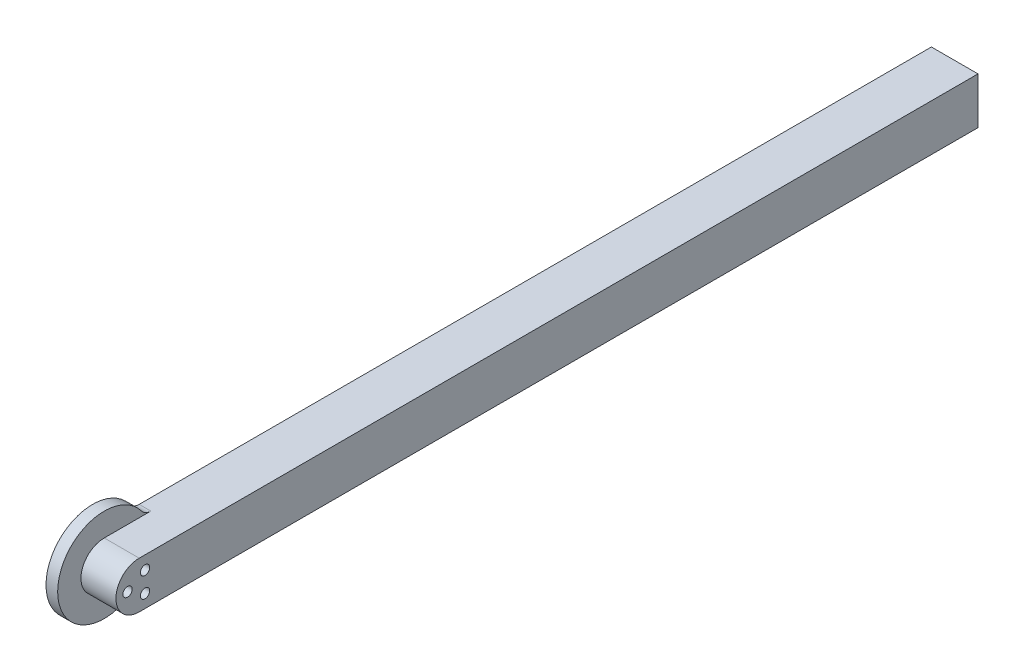
ISO-10303-21;
HEADER;
FILE_DESCRIPTION(('STEP AP214'),'2;1');
FILE_NAME('part.step','',(''),(''),'','','');
FILE_SCHEMA(('AUTOMOTIVE_DESIGN { 1 0 10303 214 1 1 1 1 }'));
ENDSEC;
DATA;
#1=APPLICATION_CONTEXT('core data for automotive mechanical design processes');
#2=APPLICATION_PROTOCOL_DEFINITION('international standard','automotive_design',2000,#1);
#3=PRODUCT_CONTEXT('',#1,'mechanical');
#4=PRODUCT('Part','Part','',(#3));
#5=PRODUCT_RELATED_PRODUCT_CATEGORY('part','',(#4));
#6=PRODUCT_DEFINITION_FORMATION('','',#4);
#7=PRODUCT_DEFINITION_CONTEXT('part definition',#1,'design');
#8=PRODUCT_DEFINITION('design','',#6,#7);
#9=PRODUCT_DEFINITION_SHAPE('','',#8);
#10=(LENGTH_UNIT() NAMED_UNIT(*) SI_UNIT(.MILLI.,.METRE.));
#11=(NAMED_UNIT(*) PLANE_ANGLE_UNIT() SI_UNIT($,.RADIAN.));
#12=(NAMED_UNIT(*) SI_UNIT($,.STERADIAN.) SOLID_ANGLE_UNIT());
#13=UNCERTAINTY_MEASURE_WITH_UNIT(LENGTH_MEASURE(1.E-05),#10,'distance_accuracy_value','');
#14=(GEOMETRIC_REPRESENTATION_CONTEXT(3) GLOBAL_UNCERTAINTY_ASSIGNED_CONTEXT((#13)) GLOBAL_UNIT_ASSIGNED_CONTEXT((#10,
#11,#12)) REPRESENTATION_CONTEXT('',''));
#15=CARTESIAN_POINT('',(0.,0.,0.));
#16=DIRECTION('',(0.,0.,1.));
#17=DIRECTION('',(1.,0.,0.));
#18=AXIS2_PLACEMENT_3D('',#15,#16,#17);
#19=CARTESIAN_POINT('',(12.7,0.,0.));
#20=DIRECTION('',(-1.,0.,0.));
#21=DIRECTION('',(0.,0.,1.));
#22=AXIS2_PLACEMENT_3D('',#19,#20,#21);
#23=CYLINDRICAL_SURFACE('',#22,12.7);
#24=CARTESIAN_POINT('',(-6.35,0.,0.));
#25=DIRECTION('',(-1.,0.,0.));
#26=DIRECTION('',(0.,0.,1.));
#27=AXIS2_PLACEMENT_3D('',#24,#25,#26);
#28=CIRCLE('',#27,12.7);
#29=CARTESIAN_POINT('',(-6.35,-12.7,0.));
#30=VERTEX_POINT('',#29);
#31=CARTESIAN_POINT('',(-6.35,12.7,0.));
#32=VERTEX_POINT('',#31);
#33=EDGE_CURVE('E121',#30,#32,#28,.T.);
#34=ORIENTED_EDGE('',*,*,#33,.F.);
#35=DIRECTION('',(-1.,0.,0.));
#36=VECTOR('',#35,1.);
#37=CARTESIAN_POINT('',(12.7,-12.7,0.));
#38=LINE('',#37,#36);
#39=CARTESIAN_POINT('',(12.7,-12.7,0.));
#40=VERTEX_POINT('',#39);
#41=EDGE_CURVE('E102',#40,#30,#38,.T.);
#42=ORIENTED_EDGE('',*,*,#41,.F.);
#43=CARTESIAN_POINT('',(12.7,0.,0.));
#44=DIRECTION('',(1.,0.,0.));
#45=DIRECTION('',(0.,0.,1.));
#46=AXIS2_PLACEMENT_3D('',#43,#44,#45);
#47=CIRCLE('',#46,12.7);
#48=CARTESIAN_POINT('',(12.7,12.7,0.));
#49=VERTEX_POINT('',#48);
#50=EDGE_CURVE('E109',#49,#40,#47,.T.);
#51=ORIENTED_EDGE('',*,*,#50,.F.);
#52=DIRECTION('',(-1.,0.,0.));
#53=VECTOR('',#52,1.);
#54=CARTESIAN_POINT('',(12.7,12.7,0.));
#55=LINE('',#54,#53);
#56=EDGE_CURVE('E166',#49,#32,#55,.T.);
#57=ORIENTED_EDGE('',*,*,#56,.T.);
#58=EDGE_LOOP('',(#34,#42,#51,#57));
#59=FACE_BOUND('',#58,.T.);
#60=ADVANCED_FACE('F33',(#59),#23,.T.);
#61=CARTESIAN_POINT('',(12.7,5.49926131403119,-3.17499999999999));
#62=DIRECTION('',(-1.,0.,0.));
#63=DIRECTION('',(0.,0.,1.));
#64=AXIS2_PLACEMENT_3D('',#61,#62,#63);
#65=CYLINDRICAL_SURFACE('',#64,2.5527);
#66=CARTESIAN_POINT('',(12.7,5.49926131403119,-3.17499999999999));
#67=DIRECTION('',(1.,0.,0.));
#68=DIRECTION('',(0.,0.,-1.));
#69=AXIS2_PLACEMENT_3D('',#66,#67,#68);
#70=CIRCLE('',#69,2.5527);
#71=CARTESIAN_POINT('',(12.7,5.49926131403119,-5.72769999999999));
#72=VERTEX_POINT('',#71);
#73=EDGE_CURVE('E169',#72,#72,#70,.T.);
#74=ORIENTED_EDGE('',*,*,#73,.T.);
#75=EDGE_LOOP('',(#74));
#76=FACE_BOUND('',#75,.T.);
#77=CARTESIAN_POINT('',(-12.7,5.49926131403119,-3.17499999999999));
#78=DIRECTION('',(1.,0.,0.));
#79=DIRECTION('',(0.,0.,-1.));
#80=AXIS2_PLACEMENT_3D('',#77,#78,#79);
#81=CIRCLE('',#80,2.5527);
#82=CARTESIAN_POINT('',(-12.7,5.49926131403119,-5.72769999999999));
#83=VERTEX_POINT('',#82);
#84=EDGE_CURVE('E186',#83,#83,#81,.T.);
#85=ORIENTED_EDGE('',*,*,#84,.F.);
#86=EDGE_LOOP('',(#85));
#87=FACE_BOUND('',#86,.T.);
#88=ADVANCED_FACE('F203',(#76,#87),#65,.F.);
#89=CARTESIAN_POINT('',(12.7,0.,6.35));
#90=DIRECTION('',(-1.,0.,0.));
#91=DIRECTION('',(0.,0.,1.));
#92=AXIS2_PLACEMENT_3D('',#89,#90,#91);
#93=CYLINDRICAL_SURFACE('',#92,2.5527);
#94=CARTESIAN_POINT('',(12.7,0.,6.35));
#95=DIRECTION('',(1.,0.,0.));
#96=DIRECTION('',(0.,0.,-1.));
#97=AXIS2_PLACEMENT_3D('',#94,#95,#96);
#98=CIRCLE('',#97,2.5527);
#99=CARTESIAN_POINT('',(12.7,0.,3.7973));
#100=VERTEX_POINT('',#99);
#101=EDGE_CURVE('E172',#100,#100,#98,.T.);
#102=ORIENTED_EDGE('',*,*,#101,.T.);
#103=EDGE_LOOP('',(#102));
#104=FACE_BOUND('',#103,.T.);
#105=CARTESIAN_POINT('',(-12.7,0.,6.35));
#106=DIRECTION('',(1.,0.,0.));
#107=DIRECTION('',(0.,0.,-1.));
#108=AXIS2_PLACEMENT_3D('',#105,#106,#107);
#109=CIRCLE('',#108,2.5527);
#110=CARTESIAN_POINT('',(-12.7,0.,3.7973));
#111=VERTEX_POINT('',#110);
#112=EDGE_CURVE('E193',#111,#111,#109,.T.);
#113=ORIENTED_EDGE('',*,*,#112,.F.);
#114=EDGE_LOOP('',(#113));
#115=FACE_BOUND('',#114,.T.);
#116=ADVANCED_FACE('F200',(#104,#115),#93,.F.);
#117=CARTESIAN_POINT('',(12.7,-5.49926131403119,-3.17499999999999));
#118=DIRECTION('',(-1.,0.,0.));
#119=DIRECTION('',(0.,0.,1.));
#120=AXIS2_PLACEMENT_3D('',#117,#118,#119);
#121=CYLINDRICAL_SURFACE('',#120,2.5527);
#122=CARTESIAN_POINT('',(12.7,-5.49926131403119,-3.17499999999999));
#123=DIRECTION('',(1.,0.,0.));
#124=DIRECTION('',(0.,0.,-1.));
#125=AXIS2_PLACEMENT_3D('',#122,#123,#124);
#126=CIRCLE('',#125,2.5527);
#127=CARTESIAN_POINT('',(12.7,-5.49926131403119,-5.72769999999999));
#128=VERTEX_POINT('',#127);
#129=EDGE_CURVE('E177',#128,#128,#126,.T.);
#130=ORIENTED_EDGE('',*,*,#129,.T.);
#131=EDGE_LOOP('',(#130));
#132=FACE_BOUND('',#131,.T.);
#133=CARTESIAN_POINT('',(-12.7,-5.49926131403119,-3.17499999999999));
#134=DIRECTION('',(1.,0.,0.));
#135=DIRECTION('',(0.,0.,-1.));
#136=AXIS2_PLACEMENT_3D('',#133,#134,#135);
#137=CIRCLE('',#136,2.5527);
#138=CARTESIAN_POINT('',(-12.7,-5.49926131403119,-5.72769999999999));
#139=VERTEX_POINT('',#138);
#140=EDGE_CURVE('E190',#139,#139,#137,.T.);
#141=ORIENTED_EDGE('',*,*,#140,.F.);
#142=EDGE_LOOP('',(#141));
#143=FACE_BOUND('',#142,.T.);
#144=ADVANCED_FACE('F202',(#132,#143),#121,.F.);
#145=CARTESIAN_POINT('',(12.7,0.,0.));
#146=DIRECTION('',(-1.,0.,0.));
#147=DIRECTION('',(0.,0.,1.));
#148=AXIS2_PLACEMENT_3D('',#145,#146,#147);
#149=PLANE('',#148);
#150=ORIENTED_EDGE('',*,*,#101,.F.);
#151=EDGE_LOOP('',(#150));
#152=FACE_BOUND('',#151,.T.);
#153=ORIENTED_EDGE('',*,*,#50,.T.);
#154=DIRECTION('',(0.,0.,-1.));
#155=VECTOR('',#154,1.);
#156=CARTESIAN_POINT('',(12.7,-12.7,0.));
#157=LINE('',#156,#155);
#158=CARTESIAN_POINT('',(12.7,-12.7,-457.2));
#159=VERTEX_POINT('',#158);
#160=EDGE_CURVE('E98',#40,#159,#157,.T.);
#161=ORIENTED_EDGE('',*,*,#160,.T.);
#162=DIRECTION('',(0.,1.,0.));
#163=VECTOR('',#162,1.);
#164=CARTESIAN_POINT('',(12.7,12.7,-457.2));
#165=LINE('',#164,#163);
#166=CARTESIAN_POINT('',(12.7,12.7,-457.2));
#167=VERTEX_POINT('',#166);
#168=EDGE_CURVE('E108',#159,#167,#165,.T.);
#169=ORIENTED_EDGE('',*,*,#168,.T.);
#170=DIRECTION('',(0.,0.,1.));
#171=VECTOR('',#170,1.);
#172=CARTESIAN_POINT('',(12.7,12.7,0.));
#173=LINE('',#172,#171);
#174=EDGE_CURVE('E115',#167,#49,#173,.T.);
#175=ORIENTED_EDGE('',*,*,#174,.T.);
#176=EDGE_LOOP('',(#153,#161,#169,#175));
#177=FACE_BOUND('',#176,.T.);
#178=ORIENTED_EDGE('',*,*,#73,.F.);
#179=EDGE_LOOP('',(#178));
#180=FACE_BOUND('',#179,.T.);
#181=ORIENTED_EDGE('',*,*,#129,.F.);
#182=EDGE_LOOP('',(#181));
#183=FACE_BOUND('',#182,.T.);
#184=ADVANCED_FACE('F112',(#152,#177,#180,#183),#149,.F.);
#185=CARTESIAN_POINT('',(-12.7,0.,0.));
#186=DIRECTION('',(-1.,0.,0.));
#187=DIRECTION('',(0.,0.,1.));
#188=AXIS2_PLACEMENT_3D('',#185,#186,#187);
#189=PLANE('',#188);
#190=ORIENTED_EDGE('',*,*,#112,.T.);
#191=EDGE_LOOP('',(#190));
#192=FACE_BOUND('',#191,.T.);
#193=ORIENTED_EDGE('',*,*,#140,.T.);
#194=EDGE_LOOP('',(#193));
#195=FACE_BOUND('',#194,.T.);
#196=ORIENTED_EDGE('',*,*,#84,.T.);
#197=EDGE_LOOP('',(#196));
#198=FACE_BOUND('',#197,.T.);
#199=DIRECTION('',(0.,0.,-1.));
#200=VECTOR('',#199,1.);
#201=CARTESIAN_POINT('',(-12.7,-12.7,0.));
#202=LINE('',#201,#200);
#203=CARTESIAN_POINT('',(-12.7,-12.7,-25.4));
#204=VERTEX_POINT('',#203);
#205=CARTESIAN_POINT('',(-12.7,-12.7,-457.2));
#206=VERTEX_POINT('',#205);
#207=EDGE_CURVE('E162',#204,#206,#202,.T.);
#208=ORIENTED_EDGE('',*,*,#207,.F.);
#209=CARTESIAN_POINT('',(-12.7,-19.05,-25.4));
#210=DIRECTION('',(-1.,0.,0.));
#211=DIRECTION('',(0.,0.,1.));
#212=AXIS2_PLACEMENT_3D('',#209,#210,#211);
#213=CIRCLE('',#212,6.35);
#214=CARTESIAN_POINT('',(-12.7,-15.24,-20.32));
#215=VERTEX_POINT('',#214);
#216=EDGE_CURVE('E137',#204,#215,#213,.F.);
#217=ORIENTED_EDGE('',*,*,#216,.T.);
#218=CARTESIAN_POINT('',(-12.7,0.,0.));
#219=DIRECTION('',(-1.,0.,0.));
#220=DIRECTION('',(0.,0.,1.));
#221=AXIS2_PLACEMENT_3D('',#218,#219,#220);
#222=CIRCLE('',#221,25.4);
#223=CARTESIAN_POINT('',(-12.7,15.24,-20.32));
#224=VERTEX_POINT('',#223);
#225=EDGE_CURVE('E153',#215,#224,#222,.T.);
#226=ORIENTED_EDGE('',*,*,#225,.T.);
#227=CARTESIAN_POINT('',(-12.7,19.05,-25.4));
#228=DIRECTION('',(-1.,0.,0.));
#229=DIRECTION('',(0.,0.,1.));
#230=AXIS2_PLACEMENT_3D('',#227,#228,#229);
#231=CIRCLE('',#230,6.35);
#232=CARTESIAN_POINT('',(-12.7,12.7,-25.4));
#233=VERTEX_POINT('',#232);
#234=EDGE_CURVE('E11',#224,#233,#231,.F.);
#235=ORIENTED_EDGE('',*,*,#234,.T.);
#236=DIRECTION('',(0.,0.,1.));
#237=VECTOR('',#236,1.);
#238=CARTESIAN_POINT('',(-12.7,12.7,0.));
#239=LINE('',#238,#237);
#240=CARTESIAN_POINT('',(-12.7,12.7,-457.2));
#241=VERTEX_POINT('',#240);
#242=EDGE_CURVE('E119',#241,#233,#239,.T.);
#243=ORIENTED_EDGE('',*,*,#242,.F.);
#244=DIRECTION('',(0.,1.,0.));
#245=VECTOR('',#244,1.);
#246=CARTESIAN_POINT('',(-12.7,12.7,-457.2));
#247=LINE('',#246,#245);
#248=EDGE_CURVE('E160',#206,#241,#247,.T.);
#249=ORIENTED_EDGE('',*,*,#248,.F.);
#250=EDGE_LOOP('',(#208,#217,#226,#235,#243,#249));
#251=FACE_BOUND('',#250,.T.);
#252=ADVANCED_FACE('F197',(#192,#195,#198,#251),#189,.T.);
#253=CARTESIAN_POINT('',(12.7,-12.7,0.));
#254=DIRECTION('',(0.,1.,0.));
#255=DIRECTION('',(0.,0.,1.));
#256=AXIS2_PLACEMENT_3D('',#253,#254,#255);
#257=PLANE('',#256);
#258=DIRECTION('',(0.,0.,1.));
#259=VECTOR('',#258,1.);
#260=CARTESIAN_POINT('',(-6.35,-12.7,0.));
#261=LINE('',#260,#259);
#262=CARTESIAN_POINT('',(-6.35,-12.7,-25.4));
#263=VERTEX_POINT('',#262);
#264=EDGE_CURVE('E182',#263,#30,#261,.T.);
#265=ORIENTED_EDGE('',*,*,#264,.F.);
#266=DIRECTION('',(-1.,0.,0.));
#267=VECTOR('',#266,1.);
#268=CARTESIAN_POINT('',(12.7,-12.7,-25.4));
#269=LINE('',#268,#267);
#270=EDGE_CURVE('E122',#263,#204,#269,.T.);
#271=ORIENTED_EDGE('',*,*,#270,.T.);
#272=ORIENTED_EDGE('',*,*,#207,.T.);
#273=DIRECTION('',(-1.,0.,0.));
#274=VECTOR('',#273,1.);
#275=CARTESIAN_POINT('',(12.7,-12.7,-457.2));
#276=LINE('',#275,#274);
#277=EDGE_CURVE('E105',#159,#206,#276,.T.);
#278=ORIENTED_EDGE('',*,*,#277,.F.);
#279=ORIENTED_EDGE('',*,*,#160,.F.);
#280=ORIENTED_EDGE('',*,*,#41,.T.);
#281=EDGE_LOOP('',(#265,#271,#272,#278,#279,#280));
#282=FACE_BOUND('',#281,.T.);
#283=ADVANCED_FACE('F100',(#282),#257,.F.);
#284=CARTESIAN_POINT('',(12.7,12.7,-457.2));
#285=DIRECTION('',(0.,0.,1.));
#286=DIRECTION('',(1.,0.,0.));
#287=AXIS2_PLACEMENT_3D('',#284,#285,#286);
#288=PLANE('',#287);
#289=ORIENTED_EDGE('',*,*,#248,.T.);
#290=DIRECTION('',(-1.,0.,0.));
#291=VECTOR('',#290,1.);
#292=CARTESIAN_POINT('',(12.7,12.7,-457.2));
#293=LINE('',#292,#291);
#294=EDGE_CURVE('E127',#167,#241,#293,.T.);
#295=ORIENTED_EDGE('',*,*,#294,.F.);
#296=ORIENTED_EDGE('',*,*,#168,.F.);
#297=ORIENTED_EDGE('',*,*,#277,.T.);
#298=EDGE_LOOP('',(#289,#295,#296,#297));
#299=FACE_BOUND('',#298,.T.);
#300=ADVANCED_FACE('F231',(#299),#288,.F.);
#301=CARTESIAN_POINT('',(12.7,12.7,0.));
#302=DIRECTION('',(0.,-1.,0.));
#303=DIRECTION('',(0.,0.,-1.));
#304=AXIS2_PLACEMENT_3D('',#301,#302,#303);
#305=PLANE('',#304);
#306=ORIENTED_EDGE('',*,*,#242,.T.);
#307=DIRECTION('',(-1.,0.,0.));
#308=VECTOR('',#307,1.);
#309=CARTESIAN_POINT('',(12.7,12.7,-25.4));
#310=LINE('',#309,#308);
#311=CARTESIAN_POINT('',(-6.35,12.7,-25.4));
#312=VERTEX_POINT('',#311);
#313=EDGE_CURVE('E134',#233,#312,#310,.F.);
#314=ORIENTED_EDGE('',*,*,#313,.T.);
#315=DIRECTION('',(0.,0.,-1.));
#316=VECTOR('',#315,1.);
#317=CARTESIAN_POINT('',(-6.35,12.7,0.));
#318=LINE('',#317,#316);
#319=EDGE_CURVE('E48',#32,#312,#318,.T.);
#320=ORIENTED_EDGE('',*,*,#319,.F.);
#321=ORIENTED_EDGE('',*,*,#56,.F.);
#322=ORIENTED_EDGE('',*,*,#174,.F.);
#323=ORIENTED_EDGE('',*,*,#294,.T.);
#324=EDGE_LOOP('',(#306,#314,#320,#321,#322,#323));
#325=FACE_BOUND('',#324,.T.);
#326=ADVANCED_FACE('F156',(#325),#305,.F.);
#327=CARTESIAN_POINT('',(-6.35,0.,0.));
#328=DIRECTION('',(-1.,0.,0.));
#329=DIRECTION('',(0.,0.,1.));
#330=AXIS2_PLACEMENT_3D('',#327,#328,#329);
#331=CYLINDRICAL_SURFACE('',#330,25.4);
#332=ORIENTED_EDGE('',*,*,#225,.F.);
#333=DIRECTION('',(-1.,0.,0.));
#334=VECTOR('',#333,1.);
#335=CARTESIAN_POINT('',(-6.35,-15.24,-20.32));
#336=LINE('',#335,#334);
#337=CARTESIAN_POINT('',(-6.35,-15.24,-20.32));
#338=VERTEX_POINT('',#337);
#339=EDGE_CURVE('E132',#215,#338,#336,.F.);
#340=ORIENTED_EDGE('',*,*,#339,.T.);
#341=CARTESIAN_POINT('',(-6.35,0.,0.));
#342=DIRECTION('',(-1.,0.,0.));
#343=DIRECTION('',(0.,0.,1.));
#344=AXIS2_PLACEMENT_3D('',#341,#342,#343);
#345=CIRCLE('',#344,25.4);
#346=CARTESIAN_POINT('',(-6.35,15.24,-20.32));
#347=VERTEX_POINT('',#346);
#348=EDGE_CURVE('E144',#338,#347,#345,.T.);
#349=ORIENTED_EDGE('',*,*,#348,.T.);
#350=DIRECTION('',(-1.,0.,0.));
#351=VECTOR('',#350,1.);
#352=CARTESIAN_POINT('',(-6.35,15.24,-20.32));
#353=LINE('',#352,#351);
#354=EDGE_CURVE('E125',#347,#224,#353,.T.);
#355=ORIENTED_EDGE('',*,*,#354,.T.);
#356=EDGE_LOOP('',(#332,#340,#349,#355));
#357=FACE_BOUND('',#356,.T.);
#358=ADVANCED_FACE('F151',(#357),#331,.T.);
#359=CARTESIAN_POINT('',(-6.35,0.,0.));
#360=DIRECTION('',(-1.,0.,0.));
#361=DIRECTION('',(0.,0.,1.));
#362=AXIS2_PLACEMENT_3D('',#359,#360,#361);
#363=PLANE('',#362);
#364=ORIENTED_EDGE('',*,*,#348,.F.);
#365=CARTESIAN_POINT('',(-6.35,-19.05,-25.4));
#366=DIRECTION('',(-1.,0.,0.));
#367=DIRECTION('',(0.,0.,1.));
#368=AXIS2_PLACEMENT_3D('',#365,#366,#367);
#369=CIRCLE('',#368,6.35);
#370=EDGE_CURVE('E139',#338,#263,#369,.T.);
#371=ORIENTED_EDGE('',*,*,#370,.T.);
#372=ORIENTED_EDGE('',*,*,#264,.T.);
#373=ORIENTED_EDGE('',*,*,#33,.T.);
#374=ORIENTED_EDGE('',*,*,#319,.T.);
#375=CARTESIAN_POINT('',(-6.35,19.05,-25.4));
#376=DIRECTION('',(-1.,0.,0.));
#377=DIRECTION('',(0.,0.,1.));
#378=AXIS2_PLACEMENT_3D('',#375,#376,#377);
#379=CIRCLE('',#378,6.35);
#380=EDGE_CURVE('E41',#312,#347,#379,.T.);
#381=ORIENTED_EDGE('',*,*,#380,.T.);
#382=EDGE_LOOP('',(#364,#371,#372,#373,#374,#381));
#383=FACE_BOUND('',#382,.T.);
#384=ADVANCED_FACE('F143',(#383),#363,.F.);
#385=CARTESIAN_POINT('',(-6.35,-19.05,-25.4));
#386=DIRECTION('',(-1.,0.,0.));
#387=DIRECTION('',(0.,0.,1.));
#388=AXIS2_PLACEMENT_3D('',#385,#386,#387);
#389=CYLINDRICAL_SURFACE('',#388,6.35);
#390=ORIENTED_EDGE('',*,*,#370,.F.);
#391=ORIENTED_EDGE('',*,*,#339,.F.);
#392=ORIENTED_EDGE('',*,*,#216,.F.);
#393=ORIENTED_EDGE('',*,*,#270,.F.);
#394=EDGE_LOOP('',(#390,#391,#392,#393));
#395=FACE_BOUND('',#394,.T.);
#396=ADVANCED_FACE('F221',(#395),#389,.F.);
#397=CARTESIAN_POINT('',(-6.35,19.05,-25.4));
#398=DIRECTION('',(-1.,0.,0.));
#399=DIRECTION('',(0.,0.,1.));
#400=AXIS2_PLACEMENT_3D('',#397,#398,#399);
#401=CYLINDRICAL_SURFACE('',#400,6.35);
#402=ORIENTED_EDGE('',*,*,#234,.F.);
#403=ORIENTED_EDGE('',*,*,#354,.F.);
#404=ORIENTED_EDGE('',*,*,#380,.F.);
#405=ORIENTED_EDGE('',*,*,#313,.F.);
#406=EDGE_LOOP('',(#402,#403,#404,#405));
#407=FACE_BOUND('',#406,.T.);
#408=ADVANCED_FACE('F35',(#407),#401,.F.);
#409=CLOSED_SHELL('',(#60,#88,#116,#144,#184,#252,#283,#300,#326,#358,#384,#396,#408));
#410=MANIFOLD_SOLID_BREP('B2',#409);
#411=ADVANCED_BREP_SHAPE_REPRESENTATION('',(#18,#410),#14);
#412=SHAPE_DEFINITION_REPRESENTATION(#9,#411);
ENDSEC;
END-ISO-10303-21;
